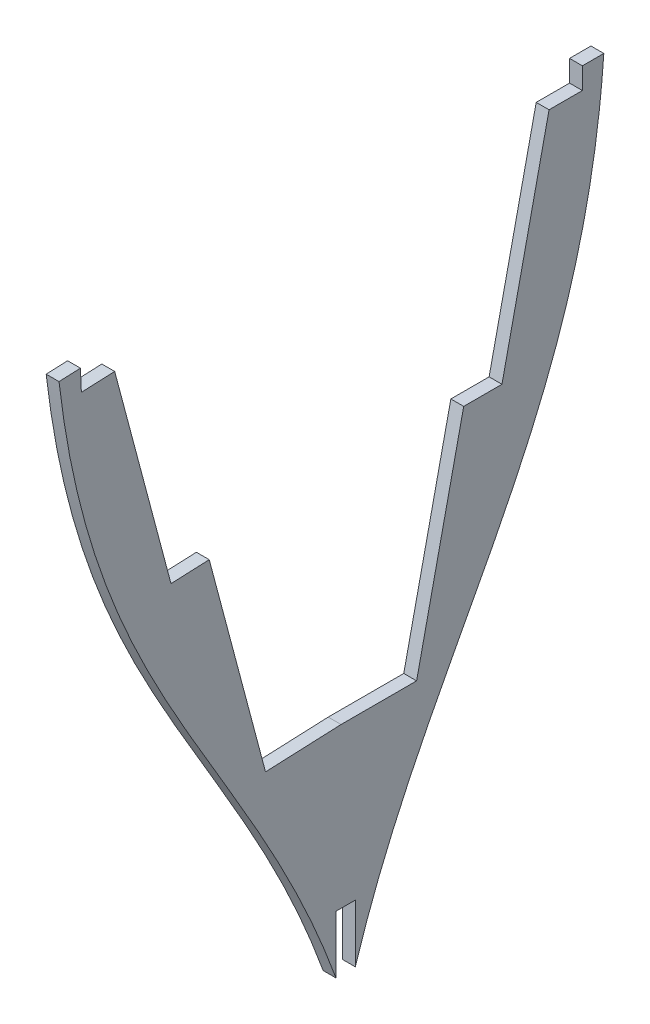
ISO-10303-21;
HEADER;
FILE_DESCRIPTION(('STEP AP214'),'2;1');
FILE_NAME('part.step','',(''),(''),'','','');
FILE_SCHEMA(('AUTOMOTIVE_DESIGN { 1 0 10303 214 1 1 1 1 }'));
ENDSEC;
DATA;
#1=APPLICATION_CONTEXT('core data for automotive mechanical design processes');
#2=APPLICATION_PROTOCOL_DEFINITION('international standard','automotive_design',2000,#1);
#3=PRODUCT_CONTEXT('',#1,'mechanical');
#4=PRODUCT('Part','Part','',(#3));
#5=PRODUCT_RELATED_PRODUCT_CATEGORY('part','',(#4));
#6=PRODUCT_DEFINITION_FORMATION('','',#4);
#7=PRODUCT_DEFINITION_CONTEXT('part definition',#1,'design');
#8=PRODUCT_DEFINITION('design','',#6,#7);
#9=PRODUCT_DEFINITION_SHAPE('','',#8);
#10=(LENGTH_UNIT() NAMED_UNIT(*) SI_UNIT(.MILLI.,.METRE.));
#11=(NAMED_UNIT(*) PLANE_ANGLE_UNIT() SI_UNIT($,.RADIAN.));
#12=(NAMED_UNIT(*) SI_UNIT($,.STERADIAN.) SOLID_ANGLE_UNIT());
#13=UNCERTAINTY_MEASURE_WITH_UNIT(LENGTH_MEASURE(1.E-05),#10,'distance_accuracy_value','');
#14=(GEOMETRIC_REPRESENTATION_CONTEXT(3) GLOBAL_UNCERTAINTY_ASSIGNED_CONTEXT((#13)) GLOBAL_UNIT_ASSIGNED_CONTEXT((#10,
#11,#12)) REPRESENTATION_CONTEXT('',''));
#15=CARTESIAN_POINT('',(0.,0.,0.));
#16=DIRECTION('',(0.,0.,1.));
#17=DIRECTION('',(1.,0.,0.));
#18=AXIS2_PLACEMENT_3D('',#15,#16,#17);
#19=CARTESIAN_POINT('',(6.,40.636249064328,0.484204578737157));
#20=CARTESIAN_POINT('',(6.,164.430620252501,-33.8263385478287));
#21=CARTESIAN_POINT('',(6.,218.251223275949,-109.23548586035));
#22=CARTESIAN_POINT('',(6.,366.039005153904,-119.711610695454));
#23=B_SPLINE_CURVE_WITH_KNOTS('',3,(#19,#20,#21,#22),.UNSPECIFIED.,.F.,.F.,(4,4),(0.,1.),.UNSPECIFIED.);
#24=DIRECTION('',(-1.,0.,0.));
#25=VECTOR('',#24,1.);
#26=SURFACE_OF_LINEAR_EXTRUSION('',#23,#25);
#27=CARTESIAN_POINT('',(6.,54.70522303446,-3.67818520229822));
#28=VERTEX_POINT('',#27);
#29=CARTESIAN_POINT('',(6.,366.039005153904,-119.711610695454));
#30=VERTEX_POINT('',#29);
#31=EDGE_CURVE('E119',#28,#30,#23,.T.);
#32=ORIENTED_EDGE('',*,*,#31,.F.);
#33=DIRECTION('',(1.,0.,0.));
#34=VECTOR('',#33,1.);
#35=CARTESIAN_POINT('',(-4.,54.70522303446,-3.67818520229822));
#36=LINE('',#35,#34);
#37=CARTESIAN_POINT('',(0.,54.70522303446,-3.67818520229822));
#38=VERTEX_POINT('',#37);
#39=EDGE_CURVE('E362',#38,#28,#36,.T.);
#40=ORIENTED_EDGE('',*,*,#39,.F.);
#41=CARTESIAN_POINT('',(0.,40.636249064328,0.484204578737157));
#42=CARTESIAN_POINT('',(0.,164.430620252501,-33.8263385478287));
#43=CARTESIAN_POINT('',(0.,218.251223275949,-109.23548586035));
#44=CARTESIAN_POINT('',(0.,366.039005153904,-119.711610695454));
#45=B_SPLINE_CURVE_WITH_KNOTS('',3,(#41,#42,#43,#44),.UNSPECIFIED.,.F.,.F.,(4,4),(0.,1.),.UNSPECIFIED.);
#46=CARTESIAN_POINT('',(0.,366.039005153904,-119.711610695454));
#47=VERTEX_POINT('',#46);
#48=EDGE_CURVE('E190',#38,#47,#45,.T.);
#49=ORIENTED_EDGE('',*,*,#48,.T.);
#50=DIRECTION('',(-1.,0.,0.));
#51=VECTOR('',#50,1.);
#52=CARTESIAN_POINT('',(6.,366.039005153904,-119.711610695454));
#53=LINE('',#52,#51);
#54=EDGE_CURVE('E266',#30,#47,#53,.T.);
#55=ORIENTED_EDGE('',*,*,#54,.F.);
#56=EDGE_LOOP('',(#32,#40,#49,#55));
#57=FACE_BOUND('',#56,.T.);
#58=ADVANCED_FACE('F33',(#57),#26,.F.);
#59=CARTESIAN_POINT('',(6.,366.039005153904,-119.711610695454));
#60=DIRECTION('',(0.,-1.,0.));
#61=DIRECTION('',(0.,0.,-1.));
#62=AXIS2_PLACEMENT_3D('',#59,#60,#61);
#63=PLANE('',#62);
#64=DIRECTION('',(0.,0.,1.));
#65=VECTOR('',#64,1.);
#66=CARTESIAN_POINT('',(0.,366.039005153904,-119.711610695454));
#67=LINE('',#66,#65);
#68=CARTESIAN_POINT('',(0.,366.039005153904,-109.711610695454));
#69=VERTEX_POINT('',#68);
#70=EDGE_CURVE('E261',#47,#69,#67,.T.);
#71=ORIENTED_EDGE('',*,*,#70,.T.);
#72=DIRECTION('',(-1.,0.,0.));
#73=VECTOR('',#72,1.);
#74=CARTESIAN_POINT('',(6.,366.039005153904,-109.711610695454));
#75=LINE('',#74,#73);
#76=CARTESIAN_POINT('',(6.,366.039005153904,-109.711610695454));
#77=VERTEX_POINT('',#76);
#78=EDGE_CURVE('E263',#77,#69,#75,.T.);
#79=ORIENTED_EDGE('',*,*,#78,.F.);
#80=DIRECTION('',(0.,0.,1.));
#81=VECTOR('',#80,1.);
#82=CARTESIAN_POINT('',(6.,366.039005153904,-119.711610695454));
#83=LINE('',#82,#81);
#84=EDGE_CURVE('E372',#30,#77,#83,.T.);
#85=ORIENTED_EDGE('',*,*,#84,.F.);
#86=ORIENTED_EDGE('',*,*,#54,.T.);
#87=EDGE_LOOP('',(#71,#79,#85,#86));
#88=FACE_BOUND('',#87,.T.);
#89=ADVANCED_FACE('F250',(#88),#63,.F.);
#90=CARTESIAN_POINT('',(6.,366.039005153904,-109.711610695454));
#91=DIRECTION('',(0.,0.,-1.));
#92=DIRECTION('',(0.,1.,0.));
#93=AXIS2_PLACEMENT_3D('',#90,#91,#92);
#94=PLANE('',#93);
#95=DIRECTION('',(0.,-1.,0.));
#96=VECTOR('',#95,1.);
#97=CARTESIAN_POINT('',(0.,366.039005153904,-109.711610695454));
#98=LINE('',#97,#96);
#99=CARTESIAN_POINT('',(0.,356.039005153904,-109.711610695454));
#100=VERTEX_POINT('',#99);
#101=EDGE_CURVE('E270',#69,#100,#98,.T.);
#102=ORIENTED_EDGE('',*,*,#101,.T.);
#103=DIRECTION('',(-1.,0.,0.));
#104=VECTOR('',#103,1.);
#105=CARTESIAN_POINT('',(6.,356.039005153904,-109.711610695454));
#106=LINE('',#105,#104);
#107=CARTESIAN_POINT('',(6.,356.039005153904,-109.711610695454));
#108=VERTEX_POINT('',#107);
#109=EDGE_CURVE('E274',#108,#100,#106,.T.);
#110=ORIENTED_EDGE('',*,*,#109,.F.);
#111=DIRECTION('',(0.,-1.,0.));
#112=VECTOR('',#111,1.);
#113=CARTESIAN_POINT('',(6.,366.039005153904,-109.711610695454));
#114=LINE('',#113,#112);
#115=EDGE_CURVE('E273',#77,#108,#114,.T.);
#116=ORIENTED_EDGE('',*,*,#115,.F.);
#117=ORIENTED_EDGE('',*,*,#78,.T.);
#118=EDGE_LOOP('',(#102,#110,#116,#117));
#119=FACE_BOUND('',#118,.T.);
#120=ADVANCED_FACE('F247',(#119),#94,.F.);
#121=CARTESIAN_POINT('',(6.,356.039005153904,-109.711610695454));
#122=DIRECTION('',(0.,-1.,0.));
#123=DIRECTION('',(0.,0.,-1.));
#124=AXIS2_PLACEMENT_3D('',#121,#122,#123);
#125=PLANE('',#124);
#126=DIRECTION('',(0.,0.,1.));
#127=VECTOR('',#126,1.);
#128=CARTESIAN_POINT('',(0.,356.039005153904,-109.711610695454));
#129=LINE('',#128,#127);
#130=CARTESIAN_POINT('',(0.,356.039005153904,-94.1380821524592));
#131=VERTEX_POINT('',#130);
#132=EDGE_CURVE('E279',#100,#131,#129,.T.);
#133=ORIENTED_EDGE('',*,*,#132,.T.);
#134=DIRECTION('',(-1.,0.,0.));
#135=VECTOR('',#134,1.);
#136=CARTESIAN_POINT('',(6.,356.039005153904,-94.1380821524592));
#137=LINE('',#136,#135);
#138=CARTESIAN_POINT('',(6.,356.039005153904,-94.1380821524592));
#139=VERTEX_POINT('',#138);
#140=EDGE_CURVE('E335',#139,#131,#137,.T.);
#141=ORIENTED_EDGE('',*,*,#140,.F.);
#142=DIRECTION('',(0.,0.,1.));
#143=VECTOR('',#142,1.);
#144=CARTESIAN_POINT('',(6.,356.039005153904,-109.711610695454));
#145=LINE('',#144,#143);
#146=EDGE_CURVE('E378',#108,#139,#145,.T.);
#147=ORIENTED_EDGE('',*,*,#146,.F.);
#148=ORIENTED_EDGE('',*,*,#109,.T.);
#149=EDGE_LOOP('',(#133,#141,#147,#148));
#150=FACE_BOUND('',#149,.T.);
#151=ADVANCED_FACE('F243',(#150),#125,.F.);
#152=CARTESIAN_POINT('',(6.,356.039005153904,-94.1380821524592));
#153=DIRECTION('',(0.,-0.21469826778103,-0.97668042563155));
#154=DIRECTION('',(0.,0.97668042563155,-0.21469826778103));
#155=AXIS2_PLACEMENT_3D('',#152,#153,#154);
#156=PLANE('',#155);
#157=DIRECTION('',(0.,-0.97668042563155,0.21469826778103));
#158=VECTOR('',#157,1.);
#159=CARTESIAN_POINT('',(0.,356.039005153904,-94.1380821524592));
#160=LINE('',#159,#158);
#161=CARTESIAN_POINT('',(0.,256.039005153904,-72.1556340408162));
#162=VERTEX_POINT('',#161);
#163=EDGE_CURVE('E281',#131,#162,#160,.T.);
#164=ORIENTED_EDGE('',*,*,#163,.T.);
#165=DIRECTION('',(-1.,0.,0.));
#166=VECTOR('',#165,1.);
#167=CARTESIAN_POINT('',(6.,256.039005153904,-72.1556340408162));
#168=LINE('',#167,#166);
#169=CARTESIAN_POINT('',(6.,256.039005153904,-72.1556340408162));
#170=VERTEX_POINT('',#169);
#171=EDGE_CURVE('E332',#170,#162,#168,.T.);
#172=ORIENTED_EDGE('',*,*,#171,.F.);
#173=DIRECTION('',(0.,-0.97668042563155,0.21469826778103));
#174=VECTOR('',#173,1.);
#175=CARTESIAN_POINT('',(6.,356.039005153904,-94.1380821524592));
#176=LINE('',#175,#174);
#177=EDGE_CURVE('E380',#139,#170,#176,.T.);
#178=ORIENTED_EDGE('',*,*,#177,.F.);
#179=ORIENTED_EDGE('',*,*,#140,.T.);
#180=EDGE_LOOP('',(#164,#172,#178,#179));
#181=FACE_BOUND('',#180,.T.);
#182=ADVANCED_FACE('F239',(#181),#156,.F.);
#183=CARTESIAN_POINT('',(6.,256.039005153904,-72.1556340408162));
#184=DIRECTION('',(0.,-1.,0.));
#185=DIRECTION('',(0.,0.,-1.));
#186=AXIS2_PLACEMENT_3D('',#183,#184,#185);
#187=PLANE('',#186);
#188=DIRECTION('',(0.,0.,1.));
#189=VECTOR('',#188,1.);
#190=CARTESIAN_POINT('',(0.,256.039005153904,-72.1556340408162));
#191=LINE('',#190,#189);
#192=CARTESIAN_POINT('',(0.,256.039005153904,-54.2883006896183));
#193=VERTEX_POINT('',#192);
#194=EDGE_CURVE('E285',#162,#193,#191,.T.);
#195=ORIENTED_EDGE('',*,*,#194,.T.);
#196=DIRECTION('',(-1.,0.,0.));
#197=VECTOR('',#196,1.);
#198=CARTESIAN_POINT('',(6.,256.039005153904,-54.2883006896183));
#199=LINE('',#198,#197);
#200=CARTESIAN_POINT('',(6.,256.039005153904,-54.2883006896183));
#201=VERTEX_POINT('',#200);
#202=EDGE_CURVE('E329',#201,#193,#199,.T.);
#203=ORIENTED_EDGE('',*,*,#202,.F.);
#204=DIRECTION('',(0.,0.,1.));
#205=VECTOR('',#204,1.);
#206=CARTESIAN_POINT('',(6.,256.039005153904,-72.1556340408162));
#207=LINE('',#206,#205);
#208=EDGE_CURVE('E382',#170,#201,#207,.T.);
#209=ORIENTED_EDGE('',*,*,#208,.F.);
#210=ORIENTED_EDGE('',*,*,#171,.T.);
#211=EDGE_LOOP('',(#195,#203,#209,#210));
#212=FACE_BOUND('',#211,.T.);
#213=ADVANCED_FACE('F235',(#212),#187,.F.);
#214=CARTESIAN_POINT('',(6.,256.039005153904,-54.2883006896183));
#215=DIRECTION('',(0.,-0.21469826778103,-0.97668042563155));
#216=DIRECTION('',(0.,0.97668042563155,-0.21469826778103));
#217=AXIS2_PLACEMENT_3D('',#214,#215,#216);
#218=PLANE('',#217);
#219=DIRECTION('',(0.,-0.97668042563155,0.21469826778103));
#220=VECTOR('',#219,1.);
#221=CARTESIAN_POINT('',(0.,256.039005153904,-54.2883006896183));
#222=LINE('',#221,#220);
#223=CARTESIAN_POINT('',(0.,156.039005153904,-32.3058525779753));
#224=VERTEX_POINT('',#223);
#225=EDGE_CURVE('E287',#193,#224,#222,.T.);
#226=ORIENTED_EDGE('',*,*,#225,.T.);
#227=DIRECTION('',(-1.,0.,0.));
#228=VECTOR('',#227,1.);
#229=CARTESIAN_POINT('',(6.,156.039005153904,-32.3058525779753));
#230=LINE('',#229,#228);
#231=CARTESIAN_POINT('',(6.,156.039005153904,-32.3058525779753));
#232=VERTEX_POINT('',#231);
#233=EDGE_CURVE('E326',#232,#224,#230,.T.);
#234=ORIENTED_EDGE('',*,*,#233,.F.);
#235=DIRECTION('',(0.,-0.97668042563155,0.21469826778103));
#236=VECTOR('',#235,1.);
#237=CARTESIAN_POINT('',(6.,256.039005153904,-54.2883006896183));
#238=LINE('',#237,#236);
#239=EDGE_CURVE('E384',#201,#232,#238,.T.);
#240=ORIENTED_EDGE('',*,*,#239,.F.);
#241=ORIENTED_EDGE('',*,*,#202,.T.);
#242=EDGE_LOOP('',(#226,#234,#240,#241));
#243=FACE_BOUND('',#242,.T.);
#244=ADVANCED_FACE('F231',(#243),#218,.F.);
#245=CARTESIAN_POINT('',(6.,156.039005153904,-32.3058525779753));
#246=DIRECTION('',(0.,-1.,0.));
#247=DIRECTION('',(0.,0.,-1.));
#248=AXIS2_PLACEMENT_3D('',#245,#246,#247);
#249=PLANE('',#248);
#250=DIRECTION('',(0.,0.,1.));
#251=VECTOR('',#250,1.);
#252=CARTESIAN_POINT('',(0.,156.039005153904,-32.3058525779753));
#253=LINE('',#252,#251);
#254=CARTESIAN_POINT('',(0.,156.039005153904,2.98263880894156));
#255=VERTEX_POINT('',#254);
#256=EDGE_CURVE('E289',#224,#255,#253,.T.);
#257=ORIENTED_EDGE('',*,*,#256,.T.);
#258=DIRECTION('',(-1.,0.,0.));
#259=VECTOR('',#258,1.);
#260=CARTESIAN_POINT('',(6.,156.039005153904,2.98263880894156));
#261=LINE('',#260,#259);
#262=CARTESIAN_POINT('',(6.,156.039005153904,2.98263880894156));
#263=VERTEX_POINT('',#262);
#264=EDGE_CURVE('E323',#263,#255,#261,.T.);
#265=ORIENTED_EDGE('',*,*,#264,.F.);
#266=DIRECTION('',(0.,0.,1.));
#267=VECTOR('',#266,1.);
#268=CARTESIAN_POINT('',(6.,156.039005153904,-32.3058525779753));
#269=LINE('',#268,#267);
#270=EDGE_CURVE('E386',#232,#263,#269,.T.);
#271=ORIENTED_EDGE('',*,*,#270,.F.);
#272=ORIENTED_EDGE('',*,*,#233,.T.);
#273=EDGE_LOOP('',(#257,#265,#271,#272));
#274=FACE_BOUND('',#273,.T.);
#275=ADVANCED_FACE('F227',(#274),#249,.F.);
#276=CARTESIAN_POINT('',(6.,154.511750988481,38.2380656121829));
#277=DIRECTION('',(0.,-0.999063020764673,-0.0432791005055166));
#278=DIRECTION('',(0.,0.0432791005055166,-0.999063020764673));
#279=AXIS2_PLACEMENT_3D('',#276,#277,#278);
#280=PLANE('',#279);
#281=DIRECTION('',(0.,-0.0432791005055166,0.999063020764673));
#282=VECTOR('',#281,1.);
#283=CARTESIAN_POINT('',(0.,154.511750988481,38.2380656121829));
#284=LINE('',#283,#282);
#285=CARTESIAN_POINT('',(0.,154.511750988481,38.2380656121829));
#286=VERTEX_POINT('',#285);
#287=EDGE_CURVE('E291',#255,#286,#284,.T.);
#288=ORIENTED_EDGE('',*,*,#287,.T.);
#289=DIRECTION('',(-1.,0.,0.));
#290=VECTOR('',#289,1.);
#291=CARTESIAN_POINT('',(6.,154.511750988481,38.2380656121829));
#292=LINE('',#291,#290);
#293=CARTESIAN_POINT('',(6.,154.511750988481,38.2380656121829));
#294=VERTEX_POINT('',#293);
#295=EDGE_CURVE('E320',#294,#286,#292,.T.);
#296=ORIENTED_EDGE('',*,*,#295,.F.);
#297=DIRECTION('',(0.,-0.0432791005055166,0.999063020764673));
#298=VECTOR('',#297,1.);
#299=CARTESIAN_POINT('',(6.,154.511750988481,38.2380656121829));
#300=LINE('',#299,#298);
#301=EDGE_CURVE('E388',#263,#294,#300,.T.);
#302=ORIENTED_EDGE('',*,*,#301,.F.);
#303=ORIENTED_EDGE('',*,*,#264,.T.);
#304=EDGE_LOOP('',(#288,#296,#302,#303));
#305=FACE_BOUND('',#304,.T.);
#306=ADVANCED_FACE('F223',(#305),#280,.F.);
#307=CARTESIAN_POINT('',(6.,253.466672483767,64.5278266769552));
#308=DIRECTION('',(0.,-0.256766950264936,0.966473348443528));
#309=DIRECTION('',(0.,-0.966473348443528,-0.256766950264936));
#310=AXIS2_PLACEMENT_3D('',#307,#308,#309);
#311=PLANE('',#310);
#312=DIRECTION('',(0.,0.966473348443527,0.256766950264936));
#313=VECTOR('',#312,1.);
#314=CARTESIAN_POINT('',(0.,253.466672483767,64.5278266769552));
#315=LINE('',#314,#313);
#316=CARTESIAN_POINT('',(0.,253.466672483767,64.5278266769552));
#317=VERTEX_POINT('',#316);
#318=EDGE_CURVE('E293',#286,#317,#315,.T.);
#319=ORIENTED_EDGE('',*,*,#318,.T.);
#320=DIRECTION('',(-1.,0.,0.));
#321=VECTOR('',#320,1.);
#322=CARTESIAN_POINT('',(6.,253.466672483767,64.5278266769552));
#323=LINE('',#322,#321);
#324=CARTESIAN_POINT('',(6.,253.466672483767,64.5278266769552));
#325=VERTEX_POINT('',#324);
#326=EDGE_CURVE('E317',#325,#317,#323,.T.);
#327=ORIENTED_EDGE('',*,*,#326,.F.);
#328=DIRECTION('',(0.,0.966473348443527,0.256766950264936));
#329=VECTOR('',#328,1.);
#330=CARTESIAN_POINT('',(6.,253.466672483767,64.5278266769552));
#331=LINE('',#330,#329);
#332=EDGE_CURVE('E390',#294,#325,#331,.T.);
#333=ORIENTED_EDGE('',*,*,#332,.F.);
#334=ORIENTED_EDGE('',*,*,#295,.T.);
#335=EDGE_LOOP('',(#319,#327,#333,#334));
#336=FACE_BOUND('',#335,.T.);
#337=ADVANCED_FACE('F219',(#336),#311,.F.);
#338=CARTESIAN_POINT('',(6.,252.693390367895,82.3784187078123));
#339=DIRECTION('',(0.,-0.999063020764673,-0.0432791005055173));
#340=DIRECTION('',(0.,0.0432791005055173,-0.999063020764673));
#341=AXIS2_PLACEMENT_3D('',#338,#339,#340);
#342=PLANE('',#341);
#343=DIRECTION('',(0.,-0.0432791005055173,0.999063020764673));
#344=VECTOR('',#343,1.);
#345=CARTESIAN_POINT('',(0.,252.693390367895,82.3784187078123));
#346=LINE('',#345,#344);
#347=CARTESIAN_POINT('',(0.,252.693390367895,82.3784187078123));
#348=VERTEX_POINT('',#347);
#349=EDGE_CURVE('E295',#317,#348,#346,.T.);
#350=ORIENTED_EDGE('',*,*,#349,.T.);
#351=DIRECTION('',(-1.,0.,0.));
#352=VECTOR('',#351,1.);
#353=CARTESIAN_POINT('',(6.,252.693390367895,82.3784187078123));
#354=LINE('',#353,#352);
#355=CARTESIAN_POINT('',(6.,252.693390367895,82.3784187078123));
#356=VERTEX_POINT('',#355);
#357=EDGE_CURVE('E314',#356,#348,#354,.T.);
#358=ORIENTED_EDGE('',*,*,#357,.F.);
#359=DIRECTION('',(0.,-0.0432791005055173,0.999063020764673));
#360=VECTOR('',#359,1.);
#361=CARTESIAN_POINT('',(6.,252.693390367895,82.3784187078123));
#362=LINE('',#361,#360);
#363=EDGE_CURVE('E392',#325,#356,#362,.T.);
#364=ORIENTED_EDGE('',*,*,#363,.F.);
#365=ORIENTED_EDGE('',*,*,#326,.T.);
#366=EDGE_LOOP('',(#350,#358,#364,#365));
#367=FACE_BOUND('',#366,.T.);
#368=ADVANCED_FACE('F215',(#367),#342,.F.);
#369=CARTESIAN_POINT('',(6.,351.648311863181,108.668179772585));
#370=DIRECTION('',(0.,-0.256766950264936,0.966473348443527));
#371=DIRECTION('',(0.,-0.966473348443527,-0.256766950264936));
#372=AXIS2_PLACEMENT_3D('',#369,#370,#371);
#373=PLANE('',#372);
#374=DIRECTION('',(0.,0.966473348443527,0.256766950264936));
#375=VECTOR('',#374,1.);
#376=CARTESIAN_POINT('',(0.,351.648311863181,108.668179772585));
#377=LINE('',#376,#375);
#378=CARTESIAN_POINT('',(0.,351.648311863181,108.668179772585));
#379=VERTEX_POINT('',#378);
#380=EDGE_CURVE('E297',#348,#379,#377,.T.);
#381=ORIENTED_EDGE('',*,*,#380,.T.);
#382=DIRECTION('',(-1.,0.,0.));
#383=VECTOR('',#382,1.);
#384=CARTESIAN_POINT('',(6.,351.648311863181,108.668179772585));
#385=LINE('',#384,#383);
#386=CARTESIAN_POINT('',(6.,351.648311863181,108.668179772585));
#387=VERTEX_POINT('',#386);
#388=EDGE_CURVE('E176',#387,#379,#385,.T.);
#389=ORIENTED_EDGE('',*,*,#388,.F.);
#390=DIRECTION('',(0.,0.966473348443527,0.256766950264936));
#391=VECTOR('',#390,1.);
#392=CARTESIAN_POINT('',(6.,351.648311863181,108.668179772585));
#393=LINE('',#392,#391);
#394=EDGE_CURVE('E164',#356,#387,#393,.T.);
#395=ORIENTED_EDGE('',*,*,#394,.F.);
#396=ORIENTED_EDGE('',*,*,#357,.T.);
#397=EDGE_LOOP('',(#381,#389,#395,#396));
#398=FACE_BOUND('',#397,.T.);
#399=ADVANCED_FACE('F212',(#398),#373,.F.);
#400=CARTESIAN_POINT('',(6.,350.974303556144,124.227116242714));
#401=DIRECTION('',(0.,-0.999063020764674,-0.0432791005055008));
#402=DIRECTION('',(0.,0.0432791005055008,-0.999063020764674));
#403=AXIS2_PLACEMENT_3D('',#400,#401,#402);
#404=PLANE('',#403);
#405=DIRECTION('',(0.,-0.0432791005055008,0.999063020764674));
#406=VECTOR('',#405,1.);
#407=CARTESIAN_POINT('',(0.,350.974303556144,124.227116242714));
#408=LINE('',#407,#406);
#409=CARTESIAN_POINT('',(0.,350.974303556144,124.227116242714));
#410=VERTEX_POINT('',#409);
#411=EDGE_CURVE('E173',#379,#410,#408,.T.);
#412=ORIENTED_EDGE('',*,*,#411,.T.);
#413=DIRECTION('',(-1.,0.,0.));
#414=VECTOR('',#413,1.);
#415=CARTESIAN_POINT('',(6.,350.974303556144,124.227116242714));
#416=LINE('',#415,#414);
#417=CARTESIAN_POINT('',(6.,350.974303556144,124.227116242714));
#418=VERTEX_POINT('',#417);
#419=EDGE_CURVE('E170',#418,#410,#416,.T.);
#420=ORIENTED_EDGE('',*,*,#419,.F.);
#421=DIRECTION('',(0.,-0.0432791005055008,0.999063020764674));
#422=VECTOR('',#421,1.);
#423=CARTESIAN_POINT('',(6.,350.974303556144,124.227116242714));
#424=LINE('',#423,#422);
#425=EDGE_CURVE('E156',#387,#418,#424,.T.);
#426=ORIENTED_EDGE('',*,*,#425,.F.);
#427=ORIENTED_EDGE('',*,*,#388,.T.);
#428=EDGE_LOOP('',(#412,#420,#426,#427));
#429=FACE_BOUND('',#428,.T.);
#430=ADVANCED_FACE('F171',(#429),#404,.F.);
#431=CARTESIAN_POINT('',(6.,360.964933763791,124.659907247769));
#432=DIRECTION('',(0.,-0.0432791005055099,0.999063020764673));
#433=DIRECTION('',(0.,-0.999063020764673,-0.0432791005055099));
#434=AXIS2_PLACEMENT_3D('',#431,#432,#433);
#435=PLANE('',#434);
#436=DIRECTION('',(0.,0.999063020764673,0.0432791005055099));
#437=VECTOR('',#436,1.);
#438=CARTESIAN_POINT('',(0.,360.964933763791,124.659907247769));
#439=LINE('',#438,#437);
#440=CARTESIAN_POINT('',(0.,360.964933763791,124.659907247769));
#441=VERTEX_POINT('',#440);
#442=EDGE_CURVE('E300',#410,#441,#439,.T.);
#443=ORIENTED_EDGE('',*,*,#442,.T.);
#444=DIRECTION('',(-1.,0.,0.));
#445=VECTOR('',#444,1.);
#446=CARTESIAN_POINT('',(6.,360.964933763791,124.659907247769));
#447=LINE('',#446,#445);
#448=CARTESIAN_POINT('',(6.,360.964933763791,124.659907247769));
#449=VERTEX_POINT('',#448);
#450=EDGE_CURVE('E177',#449,#441,#447,.T.);
#451=ORIENTED_EDGE('',*,*,#450,.F.);
#452=DIRECTION('',(0.,0.999063020764673,0.0432791005055099));
#453=VECTOR('',#452,1.);
#454=CARTESIAN_POINT('',(6.,360.964933763791,124.659907247769));
#455=LINE('',#454,#453);
#456=EDGE_CURVE('E161',#418,#449,#455,.T.);
#457=ORIENTED_EDGE('',*,*,#456,.F.);
#458=ORIENTED_EDGE('',*,*,#419,.T.);
#459=EDGE_LOOP('',(#443,#451,#457,#458));
#460=FACE_BOUND('',#459,.T.);
#461=ADVANCED_FACE('F179',(#460),#435,.F.);
#462=CARTESIAN_POINT('',(6.,360.532142758735,134.650537455416));
#463=DIRECTION('',(0.,-0.999063020764673,-0.0432791005055109));
#464=DIRECTION('',(0.,0.0432791005055109,-0.999063020764673));
#465=AXIS2_PLACEMENT_3D('',#462,#463,#464);
#466=PLANE('',#465);
#467=DIRECTION('',(0.,-0.0432791005055109,0.999063020764673));
#468=VECTOR('',#467,1.);
#469=CARTESIAN_POINT('',(0.,360.532142758735,134.650537455416));
#470=LINE('',#469,#468);
#471=CARTESIAN_POINT('',(0.,360.532142758735,134.650537455416));
#472=VERTEX_POINT('',#471);
#473=EDGE_CURVE('E111',#441,#472,#470,.T.);
#474=ORIENTED_EDGE('',*,*,#473,.T.);
#475=DIRECTION('',(-1.,0.,0.));
#476=VECTOR('',#475,1.);
#477=CARTESIAN_POINT('',(6.,360.532142758735,134.650537455416));
#478=LINE('',#477,#476);
#479=CARTESIAN_POINT('',(6.,360.532142758735,134.650537455416));
#480=VERTEX_POINT('',#479);
#481=EDGE_CURVE('E189',#480,#472,#478,.T.);
#482=ORIENTED_EDGE('',*,*,#481,.F.);
#483=DIRECTION('',(0.,-0.0432791005055109,0.999063020764673));
#484=VECTOR('',#483,1.);
#485=CARTESIAN_POINT('',(6.,360.532142758735,134.650537455416));
#486=LINE('',#485,#484);
#487=EDGE_CURVE('E57',#449,#480,#486,.T.);
#488=ORIENTED_EDGE('',*,*,#487,.F.);
#489=ORIENTED_EDGE('',*,*,#450,.T.);
#490=EDGE_LOOP('',(#474,#482,#488,#489));
#491=FACE_BOUND('',#490,.T.);
#492=ADVANCED_FACE('F202',(#491),#466,.F.);
#493=CARTESIAN_POINT('',(6.,360.532142758735,134.650537455416));
#494=CARTESIAN_POINT('',(6.,213.336232223282,117.788106266365));
#495=CARTESIAN_POINT('',(6.,162.829698052874,40.1203084715107));
#496=CARTESIAN_POINT('',(6.,40.636249064328,0.484204578737157));
#497=B_SPLINE_CURVE_WITH_KNOTS('',3,(#493,#494,#495,#496),.UNSPECIFIED.,.F.,.F.,(4,4),(0.,1.),.UNSPECIFIED.);
#498=DIRECTION('',(-1.,0.,0.));
#499=VECTOR('',#498,1.);
#500=SURFACE_OF_LINEAR_EXTRUSION('',#497,#499);
#501=CARTESIAN_POINT('',(0.,360.532142758735,134.650537455416));
#502=CARTESIAN_POINT('',(0.,213.336232223282,117.788106266365));
#503=CARTESIAN_POINT('',(0.,162.829698052874,40.1203084715107));
#504=CARTESIAN_POINT('',(0.,40.636249064328,0.484204578737157));
#505=B_SPLINE_CURVE_WITH_KNOTS('',3,(#501,#502,#503,#504),.UNSPECIFIED.,.F.,.F.,(4,4),(0.,1.),.UNSPECIFIED.);
#506=CARTESIAN_POINT('',(0.,54.70522303446,5.32181479770178));
#507=VERTEX_POINT('',#506);
#508=EDGE_CURVE('E303',#472,#507,#505,.T.);
#509=ORIENTED_EDGE('',*,*,#508,.T.);
#510=DIRECTION('',(1.,0.,0.));
#511=VECTOR('',#510,1.);
#512=CARTESIAN_POINT('',(-4.,54.70522303446,5.32181479770178));
#513=LINE('',#512,#511);
#514=CARTESIAN_POINT('',(6.,54.70522303446,5.32181479770178));
#515=VERTEX_POINT('',#514);
#516=EDGE_CURVE('E358',#507,#515,#513,.T.);
#517=ORIENTED_EDGE('',*,*,#516,.T.);
#518=EDGE_CURVE('E181',#480,#515,#497,.T.);
#519=ORIENTED_EDGE('',*,*,#518,.F.);
#520=ORIENTED_EDGE('',*,*,#481,.T.);
#521=EDGE_LOOP('',(#509,#517,#519,#520));
#522=FACE_BOUND('',#521,.T.);
#523=ADVANCED_FACE('F198',(#522),#500,.F.);
#524=CARTESIAN_POINT('',(6.,194.340098100448,-68.5516099176566));
#525=DIRECTION('',(1.,0.,0.));
#526=DIRECTION('',(0.,0.,-1.));
#527=AXIS2_PLACEMENT_3D('',#524,#525,#526);
#528=PLANE('',#527);
#529=DIRECTION('',(0.,-1.,0.));
#530=VECTOR('',#529,1.);
#531=CARTESIAN_POINT('',(6.,54.70522303446,5.32181479770178));
#532=LINE('',#531,#530);
#533=CARTESIAN_POINT('',(6.,81.70522303446,5.32181479770178));
#534=VERTEX_POINT('',#533);
#535=EDGE_CURVE('E367',#534,#515,#532,.T.);
#536=ORIENTED_EDGE('',*,*,#535,.F.);
#537=DIRECTION('',(0.,0.,1.));
#538=VECTOR('',#537,1.);
#539=CARTESIAN_POINT('',(6.,81.70522303446,5.32181479770178));
#540=LINE('',#539,#538);
#541=CARTESIAN_POINT('',(6.,81.70522303446,-3.67818520229822));
#542=VERTEX_POINT('',#541);
#543=EDGE_CURVE('E355',#542,#534,#540,.T.);
#544=ORIENTED_EDGE('',*,*,#543,.F.);
#545=DIRECTION('',(0.,1.,0.));
#546=VECTOR('',#545,1.);
#547=CARTESIAN_POINT('',(6.,81.70522303446,-3.67818520229822));
#548=LINE('',#547,#546);
#549=EDGE_CURVE('E410',#28,#542,#548,.T.);
#550=ORIENTED_EDGE('',*,*,#549,.F.);
#551=ORIENTED_EDGE('',*,*,#31,.T.);
#552=ORIENTED_EDGE('',*,*,#84,.T.);
#553=ORIENTED_EDGE('',*,*,#115,.T.);
#554=ORIENTED_EDGE('',*,*,#146,.T.);
#555=ORIENTED_EDGE('',*,*,#177,.T.);
#556=ORIENTED_EDGE('',*,*,#208,.T.);
#557=ORIENTED_EDGE('',*,*,#239,.T.);
#558=ORIENTED_EDGE('',*,*,#270,.T.);
#559=ORIENTED_EDGE('',*,*,#301,.T.);
#560=ORIENTED_EDGE('',*,*,#332,.T.);
#561=ORIENTED_EDGE('',*,*,#363,.T.);
#562=ORIENTED_EDGE('',*,*,#394,.T.);
#563=ORIENTED_EDGE('',*,*,#425,.T.);
#564=ORIENTED_EDGE('',*,*,#456,.T.);
#565=ORIENTED_EDGE('',*,*,#487,.T.);
#566=ORIENTED_EDGE('',*,*,#518,.T.);
#567=EDGE_LOOP('',(#536,#544,#550,#551,#552,#553,#554,#555,#556,#557,#558,#559,#560,#561,#562,
#563,#564,#565,#566));
#568=FACE_BOUND('',#567,.T.);
#569=ADVANCED_FACE('F159',(#568),#528,.T.);
#570=CARTESIAN_POINT('',(0.,194.340098100448,-68.5516099176566));
#571=DIRECTION('',(1.,0.,0.));
#572=DIRECTION('',(0.,0.,-1.));
#573=AXIS2_PLACEMENT_3D('',#570,#571,#572);
#574=PLANE('',#573);
#575=DIRECTION('',(0.,0.,1.));
#576=VECTOR('',#575,1.);
#577=CARTESIAN_POINT('',(0.,81.70522303446,-68.5516099176566));
#578=LINE('',#577,#576);
#579=CARTESIAN_POINT('',(0.,81.70522303446,-3.67818520229822));
#580=VERTEX_POINT('',#579);
#581=CARTESIAN_POINT('',(0.,81.70522303446,5.32181479770178));
#582=VERTEX_POINT('',#581);
#583=EDGE_CURVE('E41',#580,#582,#578,.T.);
#584=ORIENTED_EDGE('',*,*,#583,.T.);
#585=DIRECTION('',(0.,-1.,0.));
#586=VECTOR('',#585,1.);
#587=CARTESIAN_POINT('',(0.,194.340098100448,5.32181479770179));
#588=LINE('',#587,#586);
#589=EDGE_CURVE('E11',#582,#507,#588,.T.);
#590=ORIENTED_EDGE('',*,*,#589,.T.);
#591=ORIENTED_EDGE('',*,*,#508,.F.);
#592=ORIENTED_EDGE('',*,*,#473,.F.);
#593=ORIENTED_EDGE('',*,*,#442,.F.);
#594=ORIENTED_EDGE('',*,*,#411,.F.);
#595=ORIENTED_EDGE('',*,*,#380,.F.);
#596=ORIENTED_EDGE('',*,*,#349,.F.);
#597=ORIENTED_EDGE('',*,*,#318,.F.);
#598=ORIENTED_EDGE('',*,*,#287,.F.);
#599=ORIENTED_EDGE('',*,*,#256,.F.);
#600=ORIENTED_EDGE('',*,*,#225,.F.);
#601=ORIENTED_EDGE('',*,*,#194,.F.);
#602=ORIENTED_EDGE('',*,*,#163,.F.);
#603=ORIENTED_EDGE('',*,*,#132,.F.);
#604=ORIENTED_EDGE('',*,*,#101,.F.);
#605=ORIENTED_EDGE('',*,*,#70,.F.);
#606=ORIENTED_EDGE('',*,*,#48,.F.);
#607=DIRECTION('',(0.,1.,0.));
#608=VECTOR('',#607,1.);
#609=CARTESIAN_POINT('',(0.,194.340098100448,-3.67818520229821));
#610=LINE('',#609,#608);
#611=EDGE_CURVE('E340',#38,#580,#610,.T.);
#612=ORIENTED_EDGE('',*,*,#611,.T.);
#613=EDGE_LOOP('',(#584,#590,#591,#592,#593,#594,#595,#596,#597,#598,#599,#600,#601,#602,#603,
#604,#605,#606,#612));
#614=FACE_BOUND('',#613,.T.);
#615=ADVANCED_FACE('F204',(#614),#574,.F.);
#616=CARTESIAN_POINT('',(-4.,54.70522303446,5.32181479770178));
#617=DIRECTION('',(0.,0.,1.));
#618=DIRECTION('',(1.,0.,0.));
#619=AXIS2_PLACEMENT_3D('',#616,#617,#618);
#620=PLANE('',#619);
#621=DIRECTION('',(1.,0.,0.));
#622=VECTOR('',#621,1.);
#623=CARTESIAN_POINT('',(-4.,81.70522303446,5.32181479770178));
#624=LINE('',#623,#622);
#625=EDGE_CURVE('E352',#582,#534,#624,.T.);
#626=ORIENTED_EDGE('',*,*,#625,.T.);
#627=ORIENTED_EDGE('',*,*,#535,.T.);
#628=ORIENTED_EDGE('',*,*,#516,.F.);
#629=ORIENTED_EDGE('',*,*,#589,.F.);
#630=EDGE_LOOP('',(#626,#627,#628,#629));
#631=FACE_BOUND('',#630,.T.);
#632=ADVANCED_FACE('F418',(#631),#620,.F.);
#633=CARTESIAN_POINT('',(-4.,81.70522303446,5.32181479770178));
#634=DIRECTION('',(0.,1.,0.));
#635=DIRECTION('',(0.,0.,1.));
#636=AXIS2_PLACEMENT_3D('',#633,#634,#635);
#637=PLANE('',#636);
#638=DIRECTION('',(1.,0.,0.));
#639=VECTOR('',#638,1.);
#640=CARTESIAN_POINT('',(-4.,81.70522303446,-3.67818520229822));
#641=LINE('',#640,#639);
#642=EDGE_CURVE('E48',#580,#542,#641,.T.);
#643=ORIENTED_EDGE('',*,*,#642,.T.);
#644=ORIENTED_EDGE('',*,*,#543,.T.);
#645=ORIENTED_EDGE('',*,*,#625,.F.);
#646=ORIENTED_EDGE('',*,*,#583,.F.);
#647=EDGE_LOOP('',(#643,#644,#645,#646));
#648=FACE_BOUND('',#647,.T.);
#649=ADVANCED_FACE('F348',(#648),#637,.F.);
#650=CARTESIAN_POINT('',(-4.,81.70522303446,-3.67818520229822));
#651=DIRECTION('',(0.,0.,-1.));
#652=DIRECTION('',(0.,1.,0.));
#653=AXIS2_PLACEMENT_3D('',#650,#651,#652);
#654=PLANE('',#653);
#655=ORIENTED_EDGE('',*,*,#39,.T.);
#656=ORIENTED_EDGE('',*,*,#549,.T.);
#657=ORIENTED_EDGE('',*,*,#642,.F.);
#658=ORIENTED_EDGE('',*,*,#611,.F.);
#659=EDGE_LOOP('',(#655,#656,#657,#658));
#660=FACE_BOUND('',#659,.T.);
#661=ADVANCED_FACE('F409',(#660),#654,.F.);
#662=CLOSED_SHELL('',(#58,#89,#120,#151,#182,#213,#244,#275,#306,#337,#368,#399,#430,#461,#492,
#523,#569,#615,#632,#649,#661));
#663=MANIFOLD_SOLID_BREP('B2',#662);
#664=ADVANCED_BREP_SHAPE_REPRESENTATION('',(#18,#663),#14);
#665=SHAPE_DEFINITION_REPRESENTATION(#9,#664);
ENDSEC;
END-ISO-10303-21;
